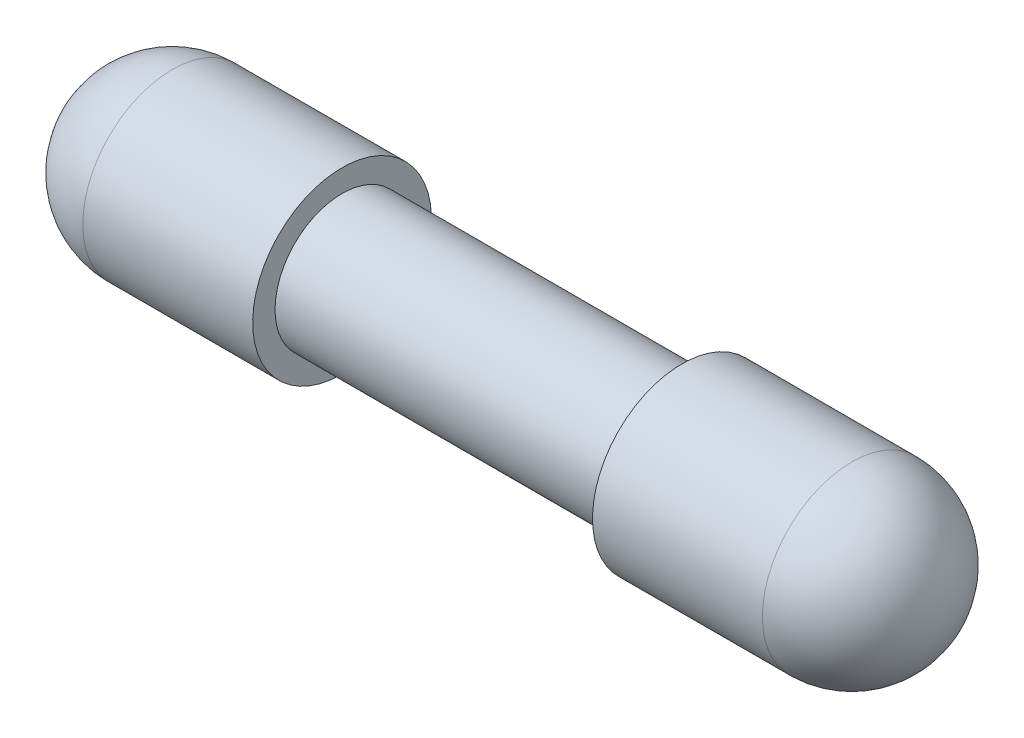
ISO-10303-21;
HEADER;
FILE_DESCRIPTION(('STEP AP214'),'2;1');
FILE_NAME('part.step','',(''),(''),'','','');
FILE_SCHEMA(('AUTOMOTIVE_DESIGN { 1 0 10303 214 1 1 1 1 }'));
ENDSEC;
DATA;
#1=APPLICATION_CONTEXT('core data for automotive mechanical design processes');
#2=APPLICATION_PROTOCOL_DEFINITION('international standard','automotive_design',2000,#1);
#3=PRODUCT_CONTEXT('',#1,'mechanical');
#4=PRODUCT('Part','Part','',(#3));
#5=PRODUCT_RELATED_PRODUCT_CATEGORY('part','',(#4));
#6=PRODUCT_DEFINITION_FORMATION('','',#4);
#7=PRODUCT_DEFINITION_CONTEXT('part definition',#1,'design');
#8=PRODUCT_DEFINITION('design','',#6,#7);
#9=PRODUCT_DEFINITION_SHAPE('','',#8);
#10=(LENGTH_UNIT() NAMED_UNIT(*) SI_UNIT(.MILLI.,.METRE.));
#11=(NAMED_UNIT(*) PLANE_ANGLE_UNIT() SI_UNIT($,.RADIAN.));
#12=(NAMED_UNIT(*) SI_UNIT($,.STERADIAN.) SOLID_ANGLE_UNIT());
#13=UNCERTAINTY_MEASURE_WITH_UNIT(LENGTH_MEASURE(1.E-05),#10,'distance_accuracy_value','');
#14=(GEOMETRIC_REPRESENTATION_CONTEXT(3) GLOBAL_UNCERTAINTY_ASSIGNED_CONTEXT((#13)) GLOBAL_UNIT_ASSIGNED_CONTEXT((#10,
#11,#12)) REPRESENTATION_CONTEXT('',''));
#15=CARTESIAN_POINT('',(0.,0.,0.));
#16=DIRECTION('',(0.,0.,1.));
#17=DIRECTION('',(1.,0.,0.));
#18=AXIS2_PLACEMENT_3D('',#15,#16,#17);
#19=CARTESIAN_POINT('',(8.44155554220252,13.6634638244499,0.));
#20=DIRECTION('',(-1.,0.,0.));
#21=DIRECTION('',(0.,1.,0.));
#22=AXIS2_PLACEMENT_3D('',#19,#20,#21);
#23=SPHERICAL_SURFACE('',#22,7.9375);
#24=CARTESIAN_POINT('',(8.44155554220253,13.6634638244499,0.));
#25=DIRECTION('',(-1.,0.,0.));
#26=DIRECTION('',(0.,-1.,0.));
#27=AXIS2_PLACEMENT_3D('',#24,#25,#26);
#28=CIRCLE('',#27,7.93749999999997);
#29=CARTESIAN_POINT('',(8.44155554220254,5.72596382444995,0.));
#30=VERTEX_POINT('',#29);
#31=EDGE_CURVE('E53',#30,#30,#28,.T.);
#32=ORIENTED_EDGE('',*,*,#31,.F.);
#33=EDGE_LOOP('',(#32));
#34=FACE_BOUND('',#33,.T.);
#35=ADVANCED_FACE('F31',(#34),#23,.T.);
#36=CARTESIAN_POINT('',(-51.8834444577975,13.6634638244499,0.));
#37=DIRECTION('',(-1.,0.,0.));
#38=DIRECTION('',(0.,1.,0.));
#39=AXIS2_PLACEMENT_3D('',#36,#37,#38);
#40=SPHERICAL_SURFACE('',#39,7.9375);
#41=CARTESIAN_POINT('',(-51.8834444577975,13.6634638244498,0.));
#42=DIRECTION('',(-1.,0.,0.));
#43=DIRECTION('',(0.,-1.,0.));
#44=AXIS2_PLACEMENT_3D('',#41,#42,#43);
#45=CIRCLE('',#44,7.93750000000006);
#46=CARTESIAN_POINT('',(-51.8834444577975,5.72596382444978,0.));
#47=VERTEX_POINT('',#46);
#48=EDGE_CURVE('E10',#47,#47,#45,.T.);
#49=ORIENTED_EDGE('',*,*,#48,.T.);
#50=EDGE_LOOP('',(#49));
#51=FACE_BOUND('',#50,.T.);
#52=ADVANCED_FACE('F60',(#51),#40,.T.);
#53=CARTESIAN_POINT('',(-6.63969445779748,13.6634638244499,0.));
#54=DIRECTION('',(-1.,0.,0.));
#55=DIRECTION('',(0.,-1.,0.));
#56=AXIS2_PLACEMENT_3D('',#53,#54,#55);
#57=CYLINDRICAL_SURFACE('',#56,7.93750000000005);
#58=ORIENTED_EDGE('',*,*,#48,.F.);
#59=EDGE_LOOP('',(#58));
#60=FACE_BOUND('',#59,.T.);
#61=CARTESIAN_POINT('',(-36.8021944577975,13.6634638244499,0.));
#62=DIRECTION('',(-1.,0.,0.));
#63=DIRECTION('',(0.,-1.,0.));
#64=AXIS2_PLACEMENT_3D('',#61,#62,#63);
#65=CIRCLE('',#64,7.93750000000004);
#66=CARTESIAN_POINT('',(-36.8021944577975,5.72596382444982,0.));
#67=VERTEX_POINT('',#66);
#68=EDGE_CURVE('E37',#67,#67,#65,.T.);
#69=ORIENTED_EDGE('',*,*,#68,.T.);
#70=EDGE_LOOP('',(#69));
#71=FACE_BOUND('',#70,.T.);
#72=ADVANCED_FACE('F64',(#60,#71),#57,.T.);
#73=CARTESIAN_POINT('',(-36.8021944577975,21.6009638244499,0.));
#74=DIRECTION('',(-1.,0.,0.));
#75=DIRECTION('',(0.,-1.,0.));
#76=AXIS2_PLACEMENT_3D('',#73,#74,#75);
#77=PLANE('',#76);
#78=ORIENTED_EDGE('',*,*,#68,.F.);
#79=EDGE_LOOP('',(#78));
#80=FACE_BOUND('',#79,.T.);
#81=CARTESIAN_POINT('',(-36.8021944577975,13.6634638244499,0.));
#82=DIRECTION('',(-1.,0.,0.));
#83=DIRECTION('',(0.,-1.,0.));
#84=AXIS2_PLACEMENT_3D('',#81,#82,#83);
#85=CIRCLE('',#84,5.95312500000005);
#86=CARTESIAN_POINT('',(-36.8021944577975,7.71033882444982,0.));
#87=VERTEX_POINT('',#86);
#88=EDGE_CURVE('E41',#87,#87,#85,.T.);
#89=ORIENTED_EDGE('',*,*,#88,.T.);
#90=EDGE_LOOP('',(#89));
#91=FACE_BOUND('',#90,.T.);
#92=ADVANCED_FACE('F68',(#80,#91),#77,.F.);
#93=CARTESIAN_POINT('',(-6.63969445779748,13.6634638244499,0.));
#94=DIRECTION('',(-1.,0.,0.));
#95=DIRECTION('',(0.,-1.,0.));
#96=AXIS2_PLACEMENT_3D('',#93,#94,#95);
#97=CYLINDRICAL_SURFACE('',#96,5.95312500000002);
#98=ORIENTED_EDGE('',*,*,#88,.F.);
#99=EDGE_LOOP('',(#98));
#100=FACE_BOUND('',#99,.T.);
#101=CARTESIAN_POINT('',(-6.63969445779747,13.6634638244499,0.));
#102=DIRECTION('',(-1.,0.,0.));
#103=DIRECTION('',(0.,-1.,0.));
#104=AXIS2_PLACEMENT_3D('',#101,#102,#103);
#105=CIRCLE('',#104,5.953125);
#106=CARTESIAN_POINT('',(-6.63969445779746,7.7103388244499,0.));
#107=VERTEX_POINT('',#106);
#108=EDGE_CURVE('E45',#107,#107,#105,.T.);
#109=ORIENTED_EDGE('',*,*,#108,.T.);
#110=EDGE_LOOP('',(#109));
#111=FACE_BOUND('',#110,.T.);
#112=ADVANCED_FACE('F74',(#100,#111),#97,.T.);
#113=CARTESIAN_POINT('',(-6.63969445779748,21.6009638244499,0.));
#114=DIRECTION('',(1.,0.,0.));
#115=DIRECTION('',(0.,1.,0.));
#116=AXIS2_PLACEMENT_3D('',#113,#114,#115);
#117=PLANE('',#116);
#118=ORIENTED_EDGE('',*,*,#108,.F.);
#119=EDGE_LOOP('',(#118));
#120=FACE_BOUND('',#119,.T.);
#121=CARTESIAN_POINT('',(-6.63969445779746,13.6634638244499,0.));
#122=DIRECTION('',(-1.,0.,0.));
#123=DIRECTION('',(0.,-1.,0.));
#124=AXIS2_PLACEMENT_3D('',#121,#122,#123);
#125=CIRCLE('',#124,7.9375);
#126=CARTESIAN_POINT('',(-6.63969445779745,5.72596382444991,0.));
#127=VERTEX_POINT('',#126);
#128=EDGE_CURVE('E50',#127,#127,#125,.T.);
#129=ORIENTED_EDGE('',*,*,#128,.T.);
#130=EDGE_LOOP('',(#129));
#131=FACE_BOUND('',#130,.T.);
#132=ADVANCED_FACE('F78',(#120,#131),#117,.F.);
#133=CARTESIAN_POINT('',(-6.63969445779748,13.6634638244499,0.));
#134=DIRECTION('',(-1.,0.,0.));
#135=DIRECTION('',(0.,-1.,0.));
#136=AXIS2_PLACEMENT_3D('',#133,#134,#135);
#137=CYLINDRICAL_SURFACE('',#136,7.93749999999999);
#138=ORIENTED_EDGE('',*,*,#128,.F.);
#139=EDGE_LOOP('',(#138));
#140=FACE_BOUND('',#139,.T.);
#141=ORIENTED_EDGE('',*,*,#31,.T.);
#142=EDGE_LOOP('',(#141));
#143=FACE_BOUND('',#142,.T.);
#144=ADVANCED_FACE('F57',(#140,#143),#137,.T.);
#145=CLOSED_SHELL('',(#35,#52,#72,#92,#112,#132,#144));
#146=MANIFOLD_SOLID_BREP('B2',#145);
#147=ADVANCED_BREP_SHAPE_REPRESENTATION('',(#18,#146),#14);
#148=SHAPE_DEFINITION_REPRESENTATION(#9,#147);
ENDSEC;
END-ISO-10303-21;
